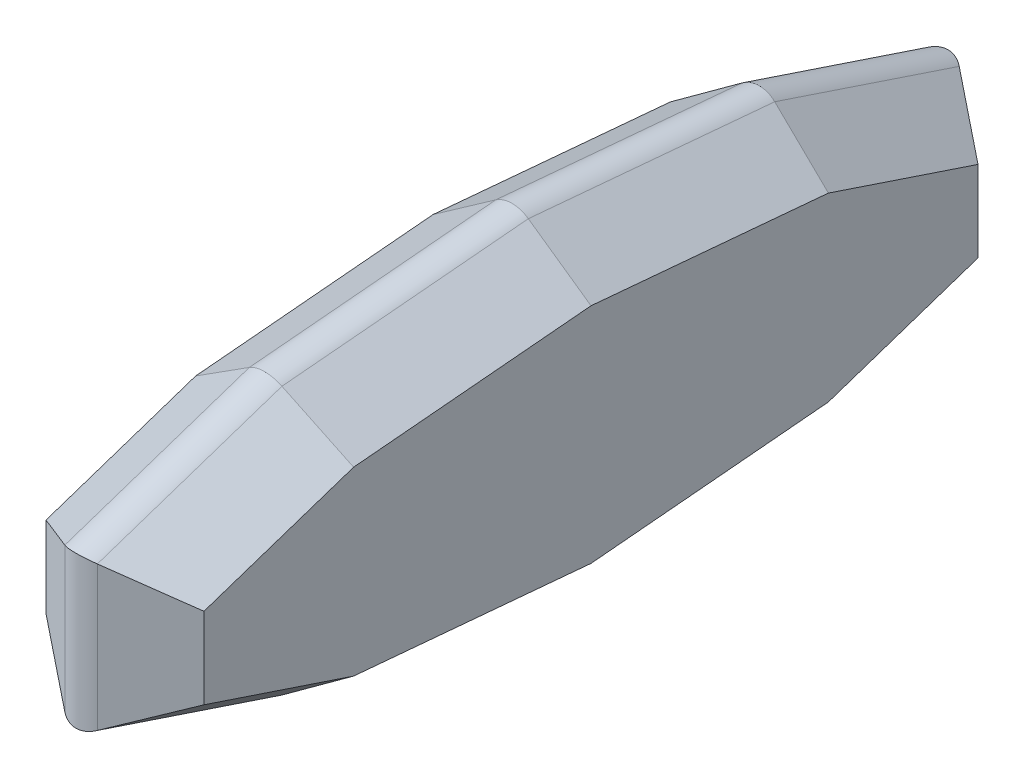
ISO-10303-21;
HEADER;
FILE_DESCRIPTION(('STEP AP214'),'2;1');
FILE_NAME('part.step','',(''),(''),'','','');
FILE_SCHEMA(('AUTOMOTIVE_DESIGN { 1 0 10303 214 1 1 1 1 }'));
ENDSEC;
DATA;
#1=APPLICATION_CONTEXT('core data for automotive mechanical design processes');
#2=APPLICATION_PROTOCOL_DEFINITION('international standard','automotive_design',2000,#1);
#3=PRODUCT_CONTEXT('',#1,'mechanical');
#4=PRODUCT('Part','Part','',(#3));
#5=PRODUCT_RELATED_PRODUCT_CATEGORY('part','',(#4));
#6=PRODUCT_DEFINITION_FORMATION('','',#4);
#7=PRODUCT_DEFINITION_CONTEXT('part definition',#1,'design');
#8=PRODUCT_DEFINITION('design','',#6,#7);
#9=PRODUCT_DEFINITION_SHAPE('','',#8);
#10=(LENGTH_UNIT() NAMED_UNIT(*) SI_UNIT(.MILLI.,.METRE.));
#11=(NAMED_UNIT(*) PLANE_ANGLE_UNIT() SI_UNIT($,.RADIAN.));
#12=(NAMED_UNIT(*) SI_UNIT($,.STERADIAN.) SOLID_ANGLE_UNIT());
#13=UNCERTAINTY_MEASURE_WITH_UNIT(LENGTH_MEASURE(1.E-05),#10,'distance_accuracy_value','');
#14=(GEOMETRIC_REPRESENTATION_CONTEXT(3) GLOBAL_UNCERTAINTY_ASSIGNED_CONTEXT((#13)) GLOBAL_UNIT_ASSIGNED_CONTEXT((#10,
#11,#12)) REPRESENTATION_CONTEXT('',''));
#15=CARTESIAN_POINT('',(0.,0.,0.));
#16=DIRECTION('',(0.,0.,1.));
#17=DIRECTION('',(1.,0.,0.));
#18=AXIS2_PLACEMENT_3D('',#15,#16,#17);
#19=CARTESIAN_POINT('',(0.,116.552688172291,-199.970092797997));
#20=DIRECTION('',(0.573576436351047,0.815932818045264,-0.0725514169368666));
#21=DIRECTION('',(-0.8180887490235,0.575091991529325,0.));
#22=AXIS2_PLACEMENT_3D('',#19,#20,#21);
#23=PLANE('',#22);
#24=DIRECTION('',(-0.817302799973305,0.564084611439917,-0.117578417630424));
#25=VECTOR('',#24,1.);
#26=CARTESIAN_POINT('',(0.,116.552688172291,-199.970092797997));
#27=LINE('',#26,#25);
#28=CARTESIAN_POINT('',(63.5,72.7263696675648,-190.834886703297));
#29=VERTEX_POINT('',#28);
#30=CARTESIAN_POINT('',(13.1119573349849,107.503100481213,-198.08378677343));
#31=VERTEX_POINT('',#30);
#32=EDGE_CURVE('E276',#29,#31,#27,.T.);
#33=ORIENTED_EDGE('',*,*,#32,.T.);
#34=DIRECTION('',(0.,-0.0885689261751643,-0.996070050406184));
#35=VECTOR('',#34,1.);
#36=CARTESIAN_POINT('',(13.1119573349849,107.407678031938,-199.156933394538));
#37=LINE('',#36,#35);
#38=CARTESIAN_POINT('',(13.111957334985,125.116388100973,0.));
#39=VERTEX_POINT('',#38);
#40=EDGE_CURVE('E353',#31,#39,#37,.F.);
#41=ORIENTED_EDGE('',*,*,#40,.T.);
#42=DIRECTION('',(-0.8180887490235,0.575091991529325,0.));
#43=VECTOR('',#42,1.);
#44=CARTESIAN_POINT('',(8.36554587553595,128.452973797929,0.));
#45=LINE('',#44,#43);
#46=CARTESIAN_POINT('',(63.5,89.6950969023388,0.));
#47=VERTEX_POINT('',#46);
#48=EDGE_CURVE('E270',#47,#39,#45,.T.);
#49=ORIENTED_EDGE('',*,*,#48,.F.);
#50=DIRECTION('',(0.,-0.0885689261751643,-0.996070050406184));
#51=VECTOR('',#50,1.);
#52=CARTESIAN_POINT('',(63.5,88.9914877793274,-7.91297811648002));
#53=LINE('',#52,#51);
#54=EDGE_CURVE('E210',#29,#47,#53,.F.);
#55=ORIENTED_EDGE('',*,*,#54,.F.);
#56=EDGE_LOOP('',(#33,#41,#49,#55));
#57=FACE_BOUND('',#56,.T.);
#58=ADVANCED_FACE('F41',(#57),#23,.T.);
#59=CARTESIAN_POINT('',(0.,116.552688172291,199.970092797997));
#60=DIRECTION('',(0.573576436351047,0.815932818045264,0.0725514169368666));
#61=DIRECTION('',(-0.8180887490235,0.575091991529325,0.));
#62=AXIS2_PLACEMENT_3D('',#59,#60,#61);
#63=PLANE('',#62);
#64=ORIENTED_EDGE('',*,*,#48,.T.);
#65=DIRECTION('',(0.,0.0885689261751643,-0.996070050406184));
#66=VECTOR('',#65,1.);
#67=CARTESIAN_POINT('',(13.1119573349849,107.407678031938,199.156933394538));
#68=LINE('',#67,#66);
#69=CARTESIAN_POINT('',(13.1119573349849,107.503100481213,198.08378677343));
#70=VERTEX_POINT('',#69);
#71=EDGE_CURVE('E348',#39,#70,#68,.F.);
#72=ORIENTED_EDGE('',*,*,#71,.T.);
#73=DIRECTION('',(-0.817302799973305,0.564084611439917,0.117578417630424));
#74=VECTOR('',#73,1.);
#75=CARTESIAN_POINT('',(9.0057692411377,110.337102170052,198.674509206515));
#76=LINE('',#75,#74);
#77=CARTESIAN_POINT('',(63.5,72.7263696675648,190.834886703297));
#78=VERTEX_POINT('',#77);
#79=EDGE_CURVE('E275',#78,#70,#76,.T.);
#80=ORIENTED_EDGE('',*,*,#79,.F.);
#81=DIRECTION('',(0.,0.0885689261751643,-0.996070050406184));
#82=VECTOR('',#81,1.);
#83=CARTESIAN_POINT('',(63.5,88.9914877793274,7.91297811648002));
#84=LINE('',#83,#82);
#85=EDGE_CURVE('E215',#47,#78,#84,.F.);
#86=ORIENTED_EDGE('',*,*,#85,.F.);
#87=EDGE_LOOP('',(#64,#72,#80,#86));
#88=FACE_BOUND('',#87,.T.);
#89=ADVANCED_FACE('F459',(#88),#63,.T.);
#90=CARTESIAN_POINT('',(0.,64.578911312509,355.6));
#91=DIRECTION('',(0.573576436351047,0.776970249544493,0.259475052722996));
#92=DIRECTION('',(-0.804525396613814,0.59391824875431,0.));
#93=AXIS2_PLACEMENT_3D('',#90,#91,#92);
#94=PLANE('',#93);
#95=ORIENTED_EDGE('',*,*,#79,.T.);
#96=DIRECTION('',(0.,0.316760550781773,-0.948505536867565));
#97=VECTOR('',#96,1.);
#98=CARTESIAN_POINT('',(13.1119573349849,55.8705953167634,352.691792441925));
#99=LINE('',#98,#97);
#100=CARTESIAN_POINT('',(13.111957334985,57.9654719969286,346.418908633359));
#101=VERTEX_POINT('',#100);
#102=EDGE_CURVE('E342',#70,#101,#99,.F.);
#103=ORIENTED_EDGE('',*,*,#102,.T.);
#104=DIRECTION('',(-0.757077956911677,0.381856727968432,0.530111692441964));
#105=VECTOR('',#104,1.);
#106=CARTESIAN_POINT('',(37.3389209571205,45.7458201461507,329.455006077208));
#107=LINE('',#106,#105);
#108=CARTESIAN_POINT('',(63.5,32.5506346936664,311.136821323683));
#109=VERTEX_POINT('',#108);
#110=EDGE_CURVE('E303',#109,#101,#107,.T.);
#111=ORIENTED_EDGE('',*,*,#110,.F.);
#112=DIRECTION('',(0.,0.316760550781773,-0.948505536867565));
#113=VECTOR('',#112,1.);
#114=CARTESIAN_POINT('',(63.5,122.765382866548,40.9984220252082));
#115=LINE('',#114,#113);
#116=EDGE_CURVE('E312',#78,#109,#115,.F.);
#117=ORIENTED_EDGE('',*,*,#116,.F.);
#118=EDGE_LOOP('',(#95,#103,#111,#117));
#119=FACE_BOUND('',#118,.T.);
#120=ADVANCED_FACE('F465',(#119),#94,.T.);
#121=CARTESIAN_POINT('',(0.,-64.578911312509,355.6));
#122=DIRECTION('',(0.573576436351047,0.,0.819152044288991));
#123=DIRECTION('',(0.819152044288991,0.,-0.573576436351047));
#124=AXIS2_PLACEMENT_3D('',#121,#122,#123);
#125=PLANE('',#124);
#126=ORIENTED_EDGE('',*,*,#110,.T.);
#127=DIRECTION('',(0.,1.,0.));
#128=VECTOR('',#127,1.);
#129=CARTESIAN_POINT('',(13.1119573349849,-64.578911312509,346.418908633359));
#130=LINE('',#129,#128);
#131=CARTESIAN_POINT('',(13.1119573349849,-57.9654719969285,346.418908633359));
#132=VERTEX_POINT('',#131);
#133=EDGE_CURVE('E274',#101,#132,#130,.F.);
#134=ORIENTED_EDGE('',*,*,#133,.T.);
#135=DIRECTION('',(-0.757077956911677,-0.381856727968432,0.530111692441964));
#136=VECTOR('',#135,1.);
#137=CARTESIAN_POINT('',(0.,-64.578911312509,355.6));
#138=LINE('',#137,#136);
#139=CARTESIAN_POINT('',(63.5,-32.5506346936664,311.136821323683));
#140=VERTEX_POINT('',#139);
#141=EDGE_CURVE('E300',#140,#132,#138,.T.);
#142=ORIENTED_EDGE('',*,*,#141,.F.);
#143=DIRECTION('',(0.,1.,0.));
#144=VECTOR('',#143,1.);
#145=CARTESIAN_POINT('',(63.5,0.,311.136821323683));
#146=LINE('',#145,#144);
#147=EDGE_CURVE('E315',#109,#140,#146,.F.);
#148=ORIENTED_EDGE('',*,*,#147,.F.);
#149=EDGE_LOOP('',(#126,#134,#142,#148));
#150=FACE_BOUND('',#149,.T.);
#151=ADVANCED_FACE('F494',(#150),#125,.T.);
#152=CARTESIAN_POINT('',(0.,-64.578911312509,355.6));
#153=DIRECTION('',(0.573576436351047,-0.776970249544493,0.259475052722996));
#154=DIRECTION('',(0.804525396613814,0.59391824875431,0.));
#155=AXIS2_PLACEMENT_3D('',#152,#153,#154);
#156=PLANE('',#155);
#157=ORIENTED_EDGE('',*,*,#141,.T.);
#158=DIRECTION('',(0.,0.316760550781773,0.948505536867565));
#159=VECTOR('',#158,1.);
#160=CARTESIAN_POINT('',(13.111957334985,-55.8705953167634,352.691792441925));
#161=LINE('',#160,#159);
#162=CARTESIAN_POINT('',(13.1119573349849,-107.503100481213,198.08378677343));
#163=VERTEX_POINT('',#162);
#164=EDGE_CURVE('E51',#132,#163,#161,.F.);
#165=ORIENTED_EDGE('',*,*,#164,.T.);
#166=DIRECTION('',(-0.817302799973305,-0.564084611439917,0.117578417630424));
#167=VECTOR('',#166,1.);
#168=CARTESIAN_POINT('',(0.,-116.552688172291,199.970092797997));
#169=LINE('',#168,#167);
#170=CARTESIAN_POINT('',(63.5,-72.7263696675648,190.834886703297));
#171=VERTEX_POINT('',#170);
#172=EDGE_CURVE('E297',#171,#163,#169,.T.);
#173=ORIENTED_EDGE('',*,*,#172,.F.);
#174=DIRECTION('',(0.,0.316760550781773,0.948505536867565));
#175=VECTOR('',#174,1.);
#176=CARTESIAN_POINT('',(63.5,-122.765382866548,40.9984220252082));
#177=LINE('',#176,#175);
#178=EDGE_CURVE('E318',#140,#171,#177,.F.);
#179=ORIENTED_EDGE('',*,*,#178,.F.);
#180=EDGE_LOOP('',(#157,#165,#173,#179));
#181=FACE_BOUND('',#180,.T.);
#182=ADVANCED_FACE('F490',(#181),#156,.T.);
#183=CARTESIAN_POINT('',(0.,-116.552688172291,199.970092797997));
#184=DIRECTION('',(0.573576436351047,-0.815932818045264,0.0725514169368666));
#185=DIRECTION('',(0.8180887490235,0.575091991529325,0.));
#186=AXIS2_PLACEMENT_3D('',#183,#184,#185);
#187=PLANE('',#186);
#188=ORIENTED_EDGE('',*,*,#172,.T.);
#189=DIRECTION('',(0.,0.0885689261751643,0.996070050406184));
#190=VECTOR('',#189,1.);
#191=CARTESIAN_POINT('',(13.1119573349849,-107.407678031938,199.156933394538));
#192=LINE('',#191,#190);
#193=CARTESIAN_POINT('',(13.111957334985,-125.116388100973,0.));
#194=VERTEX_POINT('',#193);
#195=EDGE_CURVE('E383',#163,#194,#192,.F.);
#196=ORIENTED_EDGE('',*,*,#195,.T.);
#197=DIRECTION('',(-0.8180887490235,-0.575091991529325,0.));
#198=VECTOR('',#197,1.);
#199=CARTESIAN_POINT('',(8.36554587553595,-128.452973797929,0.));
#200=LINE('',#199,#198);
#201=CARTESIAN_POINT('',(63.5,-89.6950969023388,0.));
#202=VERTEX_POINT('',#201);
#203=EDGE_CURVE('E293',#202,#194,#200,.T.);
#204=ORIENTED_EDGE('',*,*,#203,.F.);
#205=DIRECTION('',(0.,0.0885689261751643,0.996070050406184));
#206=VECTOR('',#205,1.);
#207=CARTESIAN_POINT('',(63.5,-88.9914877793274,7.91297811648002));
#208=LINE('',#207,#206);
#209=EDGE_CURVE('E321',#171,#202,#208,.F.);
#210=ORIENTED_EDGE('',*,*,#209,.F.);
#211=EDGE_LOOP('',(#188,#196,#204,#210));
#212=FACE_BOUND('',#211,.T.);
#213=ADVANCED_FACE('F486',(#212),#187,.T.);
#214=CARTESIAN_POINT('',(0.,-116.552688172291,-199.970092797997));
#215=DIRECTION('',(0.573576436351047,-0.815932818045264,-0.0725514169368666));
#216=DIRECTION('',(0.8180887490235,0.575091991529325,0.));
#217=AXIS2_PLACEMENT_3D('',#214,#215,#216);
#218=PLANE('',#217);
#219=ORIENTED_EDGE('',*,*,#203,.T.);
#220=DIRECTION('',(0.,-0.0885689261751643,0.996070050406184));
#221=VECTOR('',#220,1.);
#222=CARTESIAN_POINT('',(13.1119573349849,-107.407678031938,-199.156933394538));
#223=LINE('',#222,#221);
#224=CARTESIAN_POINT('',(13.1119573349849,-107.503100481213,-198.08378677343));
#225=VERTEX_POINT('',#224);
#226=EDGE_CURVE('E377',#194,#225,#223,.F.);
#227=ORIENTED_EDGE('',*,*,#226,.T.);
#228=DIRECTION('',(-0.817302799973305,-0.564084611439917,-0.117578417630424));
#229=VECTOR('',#228,1.);
#230=CARTESIAN_POINT('',(9.0057692411377,-110.337102170052,-198.674509206515));
#231=LINE('',#230,#229);
#232=CARTESIAN_POINT('',(63.5,-72.7263696675648,-190.834886703297));
#233=VERTEX_POINT('',#232);
#234=EDGE_CURVE('E289',#233,#225,#231,.T.);
#235=ORIENTED_EDGE('',*,*,#234,.F.);
#236=DIRECTION('',(0.,-0.0885689261751643,0.996070050406184));
#237=VECTOR('',#236,1.);
#238=CARTESIAN_POINT('',(63.5,-88.9914877793274,-7.91297811648002));
#239=LINE('',#238,#237);
#240=EDGE_CURVE('E324',#202,#233,#239,.F.);
#241=ORIENTED_EDGE('',*,*,#240,.F.);
#242=EDGE_LOOP('',(#219,#227,#235,#241));
#243=FACE_BOUND('',#242,.T.);
#244=ADVANCED_FACE('F482',(#243),#218,.T.);
#245=CARTESIAN_POINT('',(0.,-64.578911312509,-355.6));
#246=DIRECTION('',(0.573576436351047,-0.776970249544493,-0.259475052722996));
#247=DIRECTION('',(0.804525396613814,0.59391824875431,0.));
#248=AXIS2_PLACEMENT_3D('',#245,#246,#247);
#249=PLANE('',#248);
#250=ORIENTED_EDGE('',*,*,#234,.T.);
#251=DIRECTION('',(0.,-0.316760550781773,0.948505536867565));
#252=VECTOR('',#251,1.);
#253=CARTESIAN_POINT('',(13.1119573349849,-55.8705953167634,-352.691792441925));
#254=LINE('',#253,#252);
#255=CARTESIAN_POINT('',(13.1119573349849,-57.9654719969285,-346.418908633359));
#256=VERTEX_POINT('',#255);
#257=EDGE_CURVE('E371',#225,#256,#254,.F.);
#258=ORIENTED_EDGE('',*,*,#257,.T.);
#259=DIRECTION('',(-0.757077956911677,-0.381856727968432,-0.530111692441964));
#260=VECTOR('',#259,1.);
#261=CARTESIAN_POINT('',(0.,-64.578911312509,-355.6));
#262=LINE('',#261,#260);
#263=CARTESIAN_POINT('',(63.5,-32.5506346936664,-311.136821323683));
#264=VERTEX_POINT('',#263);
#265=EDGE_CURVE('E285',#264,#256,#262,.T.);
#266=ORIENTED_EDGE('',*,*,#265,.F.);
#267=DIRECTION('',(0.,-0.316760550781773,0.948505536867565));
#268=VECTOR('',#267,1.);
#269=CARTESIAN_POINT('',(63.5,-122.765382866548,-40.9984220252082));
#270=LINE('',#269,#268);
#271=EDGE_CURVE('E327',#233,#264,#270,.F.);
#272=ORIENTED_EDGE('',*,*,#271,.F.);
#273=EDGE_LOOP('',(#250,#258,#266,#272));
#274=FACE_BOUND('',#273,.T.);
#275=ADVANCED_FACE('F478',(#274),#249,.T.);
#276=CARTESIAN_POINT('',(0.,-64.578911312509,-355.6));
#277=DIRECTION('',(0.573576436351047,0.,-0.819152044288991));
#278=DIRECTION('',(-0.819152044288991,0.,-0.573576436351047));
#279=AXIS2_PLACEMENT_3D('',#276,#277,#278);
#280=PLANE('',#279);
#281=ORIENTED_EDGE('',*,*,#265,.T.);
#282=DIRECTION('',(0.,-1.,0.));
#283=VECTOR('',#282,1.);
#284=CARTESIAN_POINT('',(13.1119573349849,-64.578911312509,-346.418908633359));
#285=LINE('',#284,#283);
#286=CARTESIAN_POINT('',(13.1119573349849,57.9654719969285,-346.418908633359));
#287=VERTEX_POINT('',#286);
#288=EDGE_CURVE('E365',#256,#287,#285,.F.);
#289=ORIENTED_EDGE('',*,*,#288,.T.);
#290=DIRECTION('',(-0.757077956911677,0.381856727968432,-0.530111692441964));
#291=VECTOR('',#290,1.);
#292=CARTESIAN_POINT('',(0.,64.578911312509,-355.6));
#293=LINE('',#292,#291);
#294=CARTESIAN_POINT('',(63.5,32.5506346936664,-311.136821323683));
#295=VERTEX_POINT('',#294);
#296=EDGE_CURVE('E280',#295,#287,#293,.T.);
#297=ORIENTED_EDGE('',*,*,#296,.F.);
#298=DIRECTION('',(0.,-1.,0.));
#299=VECTOR('',#298,1.);
#300=CARTESIAN_POINT('',(63.5,0.,-311.136821323683));
#301=LINE('',#300,#299);
#302=EDGE_CURVE('E330',#264,#295,#301,.F.);
#303=ORIENTED_EDGE('',*,*,#302,.F.);
#304=EDGE_LOOP('',(#281,#289,#297,#303));
#305=FACE_BOUND('',#304,.T.);
#306=ADVANCED_FACE('F474',(#305),#280,.T.);
#307=CARTESIAN_POINT('',(0.,64.578911312509,-355.6));
#308=DIRECTION('',(0.573576436351047,0.776970249544493,-0.259475052722996));
#309=DIRECTION('',(-0.804525396613814,0.59391824875431,0.));
#310=AXIS2_PLACEMENT_3D('',#307,#308,#309);
#311=PLANE('',#310);
#312=ORIENTED_EDGE('',*,*,#296,.T.);
#313=DIRECTION('',(0.,-0.316760550781773,-0.948505536867565));
#314=VECTOR('',#313,1.);
#315=CARTESIAN_POINT('',(13.111957334985,55.8705953167634,-352.691792441925));
#316=LINE('',#315,#314);
#317=EDGE_CURVE('E359',#287,#31,#316,.F.);
#318=ORIENTED_EDGE('',*,*,#317,.T.);
#319=ORIENTED_EDGE('',*,*,#32,.F.);
#320=DIRECTION('',(0.,-0.316760550781773,-0.948505536867565));
#321=VECTOR('',#320,1.);
#322=CARTESIAN_POINT('',(63.5,122.765382866548,-40.9984220252082));
#323=LINE('',#322,#321);
#324=EDGE_CURVE('E281',#295,#29,#323,.F.);
#325=ORIENTED_EDGE('',*,*,#324,.F.);
#326=EDGE_LOOP('',(#312,#318,#319,#325));
#327=FACE_BOUND('',#326,.T.);
#328=ADVANCED_FACE('F471',(#327),#311,.T.);
#329=CARTESIAN_POINT('',(63.5,0.,0.));
#330=DIRECTION('',(-1.,0.,0.));
#331=DIRECTION('',(0.,0.,1.));
#332=AXIS2_PLACEMENT_3D('',#329,#330,#331);
#333=PLANE('',#332);
#334=ORIENTED_EDGE('',*,*,#54,.T.);
#335=ORIENTED_EDGE('',*,*,#85,.T.);
#336=ORIENTED_EDGE('',*,*,#116,.T.);
#337=ORIENTED_EDGE('',*,*,#147,.T.);
#338=ORIENTED_EDGE('',*,*,#178,.T.);
#339=ORIENTED_EDGE('',*,*,#209,.T.);
#340=ORIENTED_EDGE('',*,*,#240,.T.);
#341=ORIENTED_EDGE('',*,*,#271,.T.);
#342=ORIENTED_EDGE('',*,*,#302,.T.);
#343=ORIENTED_EDGE('',*,*,#324,.T.);
#344=EDGE_LOOP('',(#334,#335,#336,#337,#338,#339,#340,#341,#342,#343));
#345=FACE_BOUND('',#344,.T.);
#346=ADVANCED_FACE('F470',(#345),#333,.F.);
#347=CARTESIAN_POINT('',(0.,116.552688172291,199.970092797997));
#348=DIRECTION('',(-0.573576436351047,0.815932818045264,0.0725514169368666));
#349=DIRECTION('',(-0.8180887490235,-0.575091991529325,0.));
#350=AXIS2_PLACEMENT_3D('',#347,#348,#349);
#351=PLANE('',#350);
#352=DIRECTION('',(0.817302799973305,0.564084611439917,0.117578417630424));
#353=VECTOR('',#352,1.);
#354=CARTESIAN_POINT('',(0.,116.552688172291,199.970092797997));
#355=LINE('',#354,#353);
#356=CARTESIAN_POINT('',(-63.5,72.7263696675648,190.834886703297));
#357=VERTEX_POINT('',#356);
#358=CARTESIAN_POINT('',(-13.1119573349849,107.503100481213,198.08378677343));
#359=VERTEX_POINT('',#358);
#360=EDGE_CURVE('E220',#357,#359,#355,.T.);
#361=ORIENTED_EDGE('',*,*,#360,.T.);
#362=DIRECTION('',(0.,0.0885689261751643,-0.996070050406184));
#363=VECTOR('',#362,1.);
#364=CARTESIAN_POINT('',(-13.1119573349849,107.407678031938,199.156933394538));
#365=LINE('',#364,#363);
#366=CARTESIAN_POINT('',(-13.1119573349849,125.116388100973,0.));
#367=VERTEX_POINT('',#366);
#368=EDGE_CURVE('E208',#359,#367,#365,.T.);
#369=ORIENTED_EDGE('',*,*,#368,.T.);
#370=DIRECTION('',(0.8180887490235,0.575091991529325,0.));
#371=VECTOR('',#370,1.);
#372=CARTESIAN_POINT('',(0.,134.333703050757,0.));
#373=LINE('',#372,#371);
#374=CARTESIAN_POINT('',(-63.5,89.6950969023388,0.));
#375=VERTEX_POINT('',#374);
#376=EDGE_CURVE('E187',#375,#367,#373,.T.);
#377=ORIENTED_EDGE('',*,*,#376,.F.);
#378=DIRECTION('',(0.,-0.0885689261751643,0.996070050406184));
#379=VECTOR('',#378,1.);
#380=CARTESIAN_POINT('',(-63.5,72.2642475469532,196.032036808301));
#381=LINE('',#380,#379);
#382=EDGE_CURVE('E195',#357,#375,#381,.F.);
#383=ORIENTED_EDGE('',*,*,#382,.F.);
#384=EDGE_LOOP('',(#361,#369,#377,#383));
#385=FACE_BOUND('',#384,.T.);
#386=ADVANCED_FACE('F206',(#385),#351,.T.);
#387=CARTESIAN_POINT('',(0.,134.333703050757,0.));
#388=DIRECTION('',(-0.573576436351047,0.815932818045264,-0.0725514169368666));
#389=DIRECTION('',(-0.8180887490235,-0.575091991529325,0.));
#390=AXIS2_PLACEMENT_3D('',#387,#388,#389);
#391=PLANE('',#390);
#392=ORIENTED_EDGE('',*,*,#376,.T.);
#393=DIRECTION('',(0.,-0.0885689261751643,-0.996070050406184));
#394=VECTOR('',#393,1.);
#395=CARTESIAN_POINT('',(-13.1119573349849,125.188692910404,0.813159403459428));
#396=LINE('',#395,#394);
#397=CARTESIAN_POINT('',(-13.1119573349849,107.503100481213,-198.08378677343));
#398=VERTEX_POINT('',#397);
#399=EDGE_CURVE('E356',#367,#398,#396,.T.);
#400=ORIENTED_EDGE('',*,*,#399,.T.);
#401=DIRECTION('',(0.817302799973305,0.564084611439917,-0.117578417630424));
#402=VECTOR('',#401,1.);
#403=CARTESIAN_POINT('',(0.,116.552688172291,-199.970092797997));
#404=LINE('',#403,#402);
#405=CARTESIAN_POINT('',(-63.5,72.7263696675648,-190.834886703297));
#406=VERTEX_POINT('',#405);
#407=EDGE_CURVE('E190',#406,#398,#404,.T.);
#408=ORIENTED_EDGE('',*,*,#407,.F.);
#409=DIRECTION('',(0.,0.0885689261751643,0.996070050406184));
#410=VECTOR('',#409,1.);
#411=CARTESIAN_POINT('',(-63.5,90.045262425419,3.93805598969584));
#412=LINE('',#411,#410);
#413=EDGE_CURVE('E183',#375,#406,#412,.F.);
#414=ORIENTED_EDGE('',*,*,#413,.F.);
#415=EDGE_LOOP('',(#392,#400,#408,#414));
#416=FACE_BOUND('',#415,.T.);
#417=ADVANCED_FACE('F185',(#416),#391,.T.);
#418=CARTESIAN_POINT('',(0.,116.552688172291,-199.970092797997));
#419=DIRECTION('',(-0.573576436351047,0.776970249544493,-0.259475052722996));
#420=DIRECTION('',(-0.804525396613814,-0.59391824875431,0.));
#421=AXIS2_PLACEMENT_3D('',#418,#419,#420);
#422=PLANE('',#421);
#423=ORIENTED_EDGE('',*,*,#407,.T.);
#424=DIRECTION('',(0.,-0.316760550781773,-0.948505536867565));
#425=VECTOR('',#424,1.);
#426=CARTESIAN_POINT('',(-13.1119573349849,107.844372176546,-197.061885239922));
#427=LINE('',#426,#425);
#428=CARTESIAN_POINT('',(-13.1119573349849,57.9654719969285,-346.418908633359));
#429=VERTEX_POINT('',#428);
#430=EDGE_CURVE('E362',#398,#429,#427,.T.);
#431=ORIENTED_EDGE('',*,*,#430,.T.);
#432=DIRECTION('',(0.757077956911677,0.381856727968432,-0.530111692441964));
#433=VECTOR('',#432,1.);
#434=CARTESIAN_POINT('',(0.,64.578911312509,-355.6));
#435=LINE('',#434,#433);
#436=CARTESIAN_POINT('',(-63.5,32.5506346936664,-311.136821323683));
#437=VERTEX_POINT('',#436);
#438=EDGE_CURVE('E217',#437,#429,#435,.T.);
#439=ORIENTED_EDGE('',*,*,#438,.F.);
#440=DIRECTION('',(0.,0.316760550781773,0.948505536867565));
#441=VECTOR('',#440,1.);
#442=CARTESIAN_POINT('',(-63.5,74.3791170110729,-185.885911830979));
#443=LINE('',#442,#441);
#444=EDGE_CURVE('E194',#406,#437,#443,.F.);
#445=ORIENTED_EDGE('',*,*,#444,.F.);
#446=EDGE_LOOP('',(#423,#431,#439,#445));
#447=FACE_BOUND('',#446,.T.);
#448=ADVANCED_FACE('F449',(#447),#422,.T.);
#449=CARTESIAN_POINT('',(0.,64.578911312509,-355.6));
#450=DIRECTION('',(-0.573576436351047,0.,-0.819152044288991));
#451=DIRECTION('',(-0.819152044288991,0.,0.573576436351047));
#452=AXIS2_PLACEMENT_3D('',#449,#450,#451);
#453=PLANE('',#452);
#454=ORIENTED_EDGE('',*,*,#438,.T.);
#455=DIRECTION('',(0.,-1.,0.));
#456=VECTOR('',#455,1.);
#457=CARTESIAN_POINT('',(-13.1119573349849,64.578911312509,-346.418908633359));
#458=LINE('',#457,#456);
#459=CARTESIAN_POINT('',(-13.1119573349849,-57.9654719969285,-346.418908633359));
#460=VERTEX_POINT('',#459);
#461=EDGE_CURVE('E368',#429,#460,#458,.T.);
#462=ORIENTED_EDGE('',*,*,#461,.T.);
#463=DIRECTION('',(0.757077956911677,-0.381856727968432,-0.530111692441964));
#464=VECTOR('',#463,1.);
#465=CARTESIAN_POINT('',(0.,-64.578911312509,-355.6));
#466=LINE('',#465,#464);
#467=CARTESIAN_POINT('',(-63.5,-32.5506346936664,-311.136821323683));
#468=VERTEX_POINT('',#467);
#469=EDGE_CURVE('E241',#468,#460,#466,.T.);
#470=ORIENTED_EDGE('',*,*,#469,.F.);
#471=DIRECTION('',(0.,1.,0.));
#472=VECTOR('',#471,1.);
#473=CARTESIAN_POINT('',(-63.5,64.578911312509,-311.136821323683));
#474=LINE('',#473,#472);
#475=EDGE_CURVE('E250',#437,#468,#474,.F.);
#476=ORIENTED_EDGE('',*,*,#475,.F.);
#477=EDGE_LOOP('',(#454,#462,#470,#476));
#478=FACE_BOUND('',#477,.T.);
#479=ADVANCED_FACE('F439',(#478),#453,.T.);
#480=CARTESIAN_POINT('',(0.,-64.578911312509,-355.6));
#481=DIRECTION('',(-0.573576436351047,-0.776970249544493,-0.259475052722996));
#482=DIRECTION('',(0.804525396613814,-0.59391824875431,0.));
#483=AXIS2_PLACEMENT_3D('',#480,#481,#482);
#484=PLANE('',#483);
#485=ORIENTED_EDGE('',*,*,#469,.T.);
#486=DIRECTION('',(0.,-0.316760550781773,0.948505536867565));
#487=VECTOR('',#486,1.);
#488=CARTESIAN_POINT('',(-13.111957334985,-55.8705953167634,-352.691792441925));
#489=LINE('',#488,#487);
#490=CARTESIAN_POINT('',(-13.1119573349849,-107.503100481213,-198.08378677343));
#491=VERTEX_POINT('',#490);
#492=EDGE_CURVE('E374',#460,#491,#489,.T.);
#493=ORIENTED_EDGE('',*,*,#492,.T.);
#494=DIRECTION('',(0.817302799973305,-0.564084611439917,-0.117578417630424));
#495=VECTOR('',#494,1.);
#496=CARTESIAN_POINT('',(0.,-116.552688172291,-199.970092797997));
#497=LINE('',#496,#495);
#498=CARTESIAN_POINT('',(-63.5,-72.7263696675648,-190.834886703297));
#499=VERTEX_POINT('',#498);
#500=EDGE_CURVE('E237',#499,#491,#497,.T.);
#501=ORIENTED_EDGE('',*,*,#500,.F.);
#502=DIRECTION('',(0.,0.316760550781773,-0.948505536867565));
#503=VECTOR('',#502,1.);
#504=CARTESIAN_POINT('',(-63.5,-22.4053401512908,-341.515819032981));
#505=LINE('',#504,#503);
#506=EDGE_CURVE('E253',#468,#499,#505,.F.);
#507=ORIENTED_EDGE('',*,*,#506,.F.);
#508=EDGE_LOOP('',(#485,#493,#501,#507));
#509=FACE_BOUND('',#508,.T.);
#510=ADVANCED_FACE('F444',(#509),#484,.T.);
#511=CARTESIAN_POINT('',(0.,-116.552688172291,-199.970092797997));
#512=DIRECTION('',(-0.573576436351047,-0.815932818045264,-0.0725514169368666));
#513=DIRECTION('',(0.8180887490235,-0.575091991529325,0.));
#514=AXIS2_PLACEMENT_3D('',#511,#512,#513);
#515=PLANE('',#514);
#516=ORIENTED_EDGE('',*,*,#500,.T.);
#517=DIRECTION('',(0.,-0.0885689261751643,0.996070050406184));
#518=VECTOR('',#517,1.);
#519=CARTESIAN_POINT('',(-13.1119573349849,-107.407678031938,-199.156933394538));
#520=LINE('',#519,#518);
#521=CARTESIAN_POINT('',(-13.1119573349849,-125.116388100973,0.));
#522=VERTEX_POINT('',#521);
#523=EDGE_CURVE('E380',#491,#522,#520,.T.);
#524=ORIENTED_EDGE('',*,*,#523,.T.);
#525=DIRECTION('',(0.8180887490235,-0.575091991529325,0.));
#526=VECTOR('',#525,1.);
#527=CARTESIAN_POINT('',(0.,-134.333703050757,0.));
#528=LINE('',#527,#526);
#529=CARTESIAN_POINT('',(-63.5,-89.6950969023388,0.));
#530=VERTEX_POINT('',#529);
#531=EDGE_CURVE('E234',#530,#522,#528,.T.);
#532=ORIENTED_EDGE('',*,*,#531,.F.);
#533=DIRECTION('',(0.,0.0885689261751643,-0.996070050406184));
#534=VECTOR('',#533,1.);
#535=CARTESIAN_POINT('',(-63.5,-72.2642475469532,-196.032036808301));
#536=LINE('',#535,#534);
#537=EDGE_CURVE('E256',#499,#530,#536,.F.);
#538=ORIENTED_EDGE('',*,*,#537,.F.);
#539=EDGE_LOOP('',(#516,#524,#532,#538));
#540=FACE_BOUND('',#539,.T.);
#541=ADVANCED_FACE('F559',(#540),#515,.T.);
#542=CARTESIAN_POINT('',(0.,-134.333703050757,0.));
#543=DIRECTION('',(-0.573576436351047,-0.815932818045264,0.0725514169368666));
#544=DIRECTION('',(0.8180887490235,-0.575091991529325,0.));
#545=AXIS2_PLACEMENT_3D('',#542,#543,#544);
#546=PLANE('',#545);
#547=ORIENTED_EDGE('',*,*,#531,.T.);
#548=DIRECTION('',(0.,0.0885689261751643,0.996070050406184));
#549=VECTOR('',#548,1.);
#550=CARTESIAN_POINT('',(-13.1119573349849,-125.188692910404,-0.813159403459428));
#551=LINE('',#550,#549);
#552=CARTESIAN_POINT('',(-13.1119573349849,-107.503100481213,198.08378677343));
#553=VERTEX_POINT('',#552);
#554=EDGE_CURVE('E59',#522,#553,#551,.T.);
#555=ORIENTED_EDGE('',*,*,#554,.T.);
#556=DIRECTION('',(0.817302799973305,-0.564084611439917,0.117578417630424));
#557=VECTOR('',#556,1.);
#558=CARTESIAN_POINT('',(0.,-116.552688172291,199.970092797997));
#559=LINE('',#558,#557);
#560=CARTESIAN_POINT('',(-63.5,-72.7263696675648,190.834886703297));
#561=VERTEX_POINT('',#560);
#562=EDGE_CURVE('E231',#561,#553,#559,.T.);
#563=ORIENTED_EDGE('',*,*,#562,.F.);
#564=DIRECTION('',(0.,-0.0885689261751643,-0.996070050406184));
#565=VECTOR('',#564,1.);
#566=CARTESIAN_POINT('',(-63.5,-90.045262425419,-3.93805598969584));
#567=LINE('',#566,#565);
#568=EDGE_CURVE('E259',#530,#561,#567,.F.);
#569=ORIENTED_EDGE('',*,*,#568,.F.);
#570=EDGE_LOOP('',(#547,#555,#563,#569));
#571=FACE_BOUND('',#570,.T.);
#572=ADVANCED_FACE('F555',(#571),#546,.T.);
#573=CARTESIAN_POINT('',(0.,-116.552688172291,199.970092797997));
#574=DIRECTION('',(-0.573576436351047,-0.776970249544493,0.259475052722996));
#575=DIRECTION('',(0.804525396613814,-0.59391824875431,0.));
#576=AXIS2_PLACEMENT_3D('',#573,#574,#575);
#577=PLANE('',#576);
#578=ORIENTED_EDGE('',*,*,#562,.T.);
#579=DIRECTION('',(0.,0.316760550781773,0.948505536867565));
#580=VECTOR('',#579,1.);
#581=CARTESIAN_POINT('',(-13.1119573349849,-107.844372176546,197.061885239922));
#582=LINE('',#581,#580);
#583=CARTESIAN_POINT('',(-13.1119573349849,-57.9654719969285,346.418908633359));
#584=VERTEX_POINT('',#583);
#585=EDGE_CURVE('E11',#553,#584,#582,.T.);
#586=ORIENTED_EDGE('',*,*,#585,.T.);
#587=DIRECTION('',(0.757077956911677,-0.381856727968432,0.530111692441964));
#588=VECTOR('',#587,1.);
#589=CARTESIAN_POINT('',(0.,-64.578911312509,355.6));
#590=LINE('',#589,#588);
#591=CARTESIAN_POINT('',(-63.5,-32.5506346936664,311.136821323683));
#592=VERTEX_POINT('',#591);
#593=EDGE_CURVE('E227',#592,#584,#590,.T.);
#594=ORIENTED_EDGE('',*,*,#593,.F.);
#595=DIRECTION('',(0.,-0.316760550781773,-0.948505536867565));
#596=VECTOR('',#595,1.);
#597=CARTESIAN_POINT('',(-63.5,-74.3791170110729,185.885911830979));
#598=LINE('',#597,#596);
#599=EDGE_CURVE('E262',#561,#592,#598,.F.);
#600=ORIENTED_EDGE('',*,*,#599,.F.);
#601=EDGE_LOOP('',(#578,#586,#594,#600));
#602=FACE_BOUND('',#601,.T.);
#603=ADVANCED_FACE('F551',(#602),#577,.T.);
#604=CARTESIAN_POINT('',(0.,-64.578911312509,355.6));
#605=DIRECTION('',(-0.573576436351047,0.,0.819152044288991));
#606=DIRECTION('',(0.819152044288991,0.,0.573576436351047));
#607=AXIS2_PLACEMENT_3D('',#604,#605,#606);
#608=PLANE('',#607);
#609=ORIENTED_EDGE('',*,*,#593,.T.);
#610=DIRECTION('',(0.,1.,0.));
#611=VECTOR('',#610,1.);
#612=CARTESIAN_POINT('',(-13.1119573349849,-64.578911312509,346.418908633359));
#613=LINE('',#612,#611);
#614=CARTESIAN_POINT('',(-13.1119573349849,57.9654719969285,346.418908633359));
#615=VERTEX_POINT('',#614);
#616=EDGE_CURVE('E338',#584,#615,#613,.T.);
#617=ORIENTED_EDGE('',*,*,#616,.T.);
#618=DIRECTION('',(0.757077956911677,0.381856727968432,0.530111692441964));
#619=VECTOR('',#618,1.);
#620=CARTESIAN_POINT('',(0.,64.578911312509,355.6));
#621=LINE('',#620,#619);
#622=CARTESIAN_POINT('',(-63.5,32.5506346936664,311.136821323683));
#623=VERTEX_POINT('',#622);
#624=EDGE_CURVE('E223',#623,#615,#621,.T.);
#625=ORIENTED_EDGE('',*,*,#624,.F.);
#626=DIRECTION('',(0.,-1.,0.));
#627=VECTOR('',#626,1.);
#628=CARTESIAN_POINT('',(-63.5,-64.578911312509,311.136821323683));
#629=LINE('',#628,#627);
#630=EDGE_CURVE('E265',#592,#623,#629,.F.);
#631=ORIENTED_EDGE('',*,*,#630,.F.);
#632=EDGE_LOOP('',(#609,#617,#625,#631));
#633=FACE_BOUND('',#632,.T.);
#634=ADVANCED_FACE('F543',(#633),#608,.T.);
#635=CARTESIAN_POINT('',(0.,64.578911312509,355.6));
#636=DIRECTION('',(-0.573576436351047,0.776970249544493,0.259475052722996));
#637=DIRECTION('',(-0.804525396613814,-0.59391824875431,0.));
#638=AXIS2_PLACEMENT_3D('',#635,#636,#637);
#639=PLANE('',#638);
#640=ORIENTED_EDGE('',*,*,#624,.T.);
#641=DIRECTION('',(0.,0.316760550781773,-0.948505536867565));
#642=VECTOR('',#641,1.);
#643=CARTESIAN_POINT('',(-13.111957334985,55.8705953167634,352.691792441925));
#644=LINE('',#643,#642);
#645=EDGE_CURVE('E345',#615,#359,#644,.T.);
#646=ORIENTED_EDGE('',*,*,#645,.T.);
#647=ORIENTED_EDGE('',*,*,#360,.F.);
#648=DIRECTION('',(0.,-0.316760550781773,0.948505536867565));
#649=VECTOR('',#648,1.);
#650=CARTESIAN_POINT('',(-63.5,22.4053401512908,341.515819032981));
#651=LINE('',#650,#649);
#652=EDGE_CURVE('E200',#623,#357,#651,.F.);
#653=ORIENTED_EDGE('',*,*,#652,.F.);
#654=EDGE_LOOP('',(#640,#646,#647,#653));
#655=FACE_BOUND('',#654,.T.);
#656=ADVANCED_FACE('F538',(#655),#639,.T.);
#657=CARTESIAN_POINT('',(-63.5,0.,0.));
#658=DIRECTION('',(-1.,0.,0.));
#659=DIRECTION('',(0.,0.,1.));
#660=AXIS2_PLACEMENT_3D('',#657,#658,#659);
#661=PLANE('',#660);
#662=ORIENTED_EDGE('',*,*,#382,.T.);
#663=ORIENTED_EDGE('',*,*,#413,.T.);
#664=ORIENTED_EDGE('',*,*,#444,.T.);
#665=ORIENTED_EDGE('',*,*,#475,.T.);
#666=ORIENTED_EDGE('',*,*,#506,.T.);
#667=ORIENTED_EDGE('',*,*,#537,.T.);
#668=ORIENTED_EDGE('',*,*,#568,.T.);
#669=ORIENTED_EDGE('',*,*,#599,.T.);
#670=ORIENTED_EDGE('',*,*,#630,.T.);
#671=ORIENTED_EDGE('',*,*,#652,.T.);
#672=EDGE_LOOP('',(#662,#663,#664,#665,#666,#667,#668,#669,#670,#671));
#673=FACE_BOUND('',#672,.T.);
#674=ADVANCED_FACE('F198',(#673),#661,.T.);
#675=CARTESIAN_POINT('',(0.,-64.578911312509,-327.693092900913));
#676=DIRECTION('',(0.,1.,0.));
#677=DIRECTION('',(0.,0.,1.));
#678=AXIS2_PLACEMENT_3D('',#675,#676,#677);
#679=CYLINDRICAL_SURFACE('',#678,22.86);
#680=CARTESIAN_POINT('',(0.,-44.4766566659696,-327.693092900913));
#681=DIRECTION('',(0.,0.81140635651373,-0.584482441660238));
#682=DIRECTION('',(0.,-0.584482441660238,-0.81140635651373));
#683=AXIS2_PLACEMENT_3D('',#680,#681,#682);
#684=ELLIPSE('',#683,28.1733065269784,22.86);
#685=EDGE_CURVE('E419',#460,#256,#684,.F.);
#686=ORIENTED_EDGE('',*,*,#685,.F.);
#687=ORIENTED_EDGE('',*,*,#461,.F.);
#688=CARTESIAN_POINT('',(0.,44.4766566659696,-327.693092900913));
#689=DIRECTION('',(0.,0.81140635651373,0.584482441660238));
#690=DIRECTION('',(0.,0.584482441660238,-0.81140635651373));
#691=AXIS2_PLACEMENT_3D('',#688,#689,#690);
#692=ELLIPSE('',#691,28.1733065269784,22.86);
#693=EDGE_CURVE('E45',#287,#429,#692,.T.);
#694=ORIENTED_EDGE('',*,*,#693,.F.);
#695=ORIENTED_EDGE('',*,*,#288,.F.);
#696=EDGE_LOOP('',(#686,#687,#694,#695));
#697=FACE_BOUND('',#696,.T.);
#698=ADVANCED_FACE('F43',(#697),#679,.T.);
#699=CARTESIAN_POINT('',(0.,38.1090554121763,-346.760192736677));
#700=DIRECTION('',(0.,0.316760550781773,0.948505536867565));
#701=DIRECTION('',(0.,-0.948505536867565,0.316760550781773));
#702=AXIS2_PLACEMENT_3D('',#699,#700,#701);
#703=CYLINDRICAL_SURFACE('',#702,22.86);
#704=ORIENTED_EDGE('',*,*,#693,.T.);
#705=ORIENTED_EDGE('',*,*,#430,.F.);
#706=CARTESIAN_POINT('',(0.,89.0455005303546,-194.236464312466));
#707=DIRECTION('',(0.,0.204055364937038,0.978959349534194));
#708=DIRECTION('',(0.,0.978959349534194,-0.204055364937037));
#709=AXIS2_PLACEMENT_3D('',#706,#707,#708);
#710=ELLIPSE('',#709,23.0168586675785,22.86);
#711=EDGE_CURVE('E416',#31,#398,#710,.T.);
#712=ORIENTED_EDGE('',*,*,#711,.F.);
#713=ORIENTED_EDGE('',*,*,#317,.F.);
#714=EDGE_LOOP('',(#704,#705,#712,#713));
#715=FACE_BOUND('',#714,.T.);
#716=ADVANCED_FACE('F432',(#715),#703,.T.);
#717=CARTESIAN_POINT('',(0.,-38.1090554121763,-346.760192736677));
#718=DIRECTION('',(0.,0.316760550781773,-0.948505536867565));
#719=DIRECTION('',(0.,0.948505536867565,0.316760550781773));
#720=AXIS2_PLACEMENT_3D('',#717,#718,#719);
#721=CYLINDRICAL_SURFACE('',#720,22.86);
#722=ORIENTED_EDGE('',*,*,#685,.T.);
#723=ORIENTED_EDGE('',*,*,#257,.F.);
#724=CARTESIAN_POINT('',(0.,-89.0455005303547,-194.236464312465));
#725=DIRECTION('',(0.,0.204055364937038,-0.978959349534194));
#726=DIRECTION('',(0.,-0.978959349534194,-0.204055364937037));
#727=AXIS2_PLACEMENT_3D('',#724,#725,#726);
#728=ELLIPSE('',#727,23.0168586675785,22.86);
#729=EDGE_CURVE('E412',#491,#225,#728,.F.);
#730=ORIENTED_EDGE('',*,*,#729,.F.);
#731=ORIENTED_EDGE('',*,*,#492,.F.);
#732=EDGE_LOOP('',(#722,#723,#730,#731));
#733=FACE_BOUND('',#732,.T.);
#734=ADVANCED_FACE('F528',(#733),#721,.T.);
#735=CARTESIAN_POINT('',(0.,88.7554538114229,-197.498408003361));
#736=DIRECTION('',(0.,0.0885689261751643,0.996070050406184));
#737=DIRECTION('',(0.,-0.996070050406184,0.0885689261751643));
#738=AXIS2_PLACEMENT_3D('',#735,#736,#737);
#739=CYLINDRICAL_SURFACE('',#738,22.86);
#740=ORIENTED_EDGE('',*,*,#711,.T.);
#741=ORIENTED_EDGE('',*,*,#399,.F.);
#742=CARTESIAN_POINT('',(0.,106.316690504594,2.77555756156289E-13));
#743=DIRECTION('',(0.,0.,1.));
#744=DIRECTION('',(0.,1.,0.));
#745=AXIS2_PLACEMENT_3D('',#742,#743,#744);
#746=ELLIPSE('',#745,22.9501931020594,22.86);
#747=EDGE_CURVE('E408',#39,#367,#746,.T.);
#748=ORIENTED_EDGE('',*,*,#747,.F.);
#749=ORIENTED_EDGE('',*,*,#40,.F.);
#750=EDGE_LOOP('',(#740,#741,#748,#749));
#751=FACE_BOUND('',#750,.T.);
#752=ADVANCED_FACE('F524',(#751),#739,.T.);
#753=CARTESIAN_POINT('',(0.,-88.7554538114229,-197.498408003361));
#754=DIRECTION('',(0.,0.0885689261751643,-0.996070050406184));
#755=DIRECTION('',(0.,0.996070050406184,0.0885689261751643));
#756=AXIS2_PLACEMENT_3D('',#753,#754,#755);
#757=CYLINDRICAL_SURFACE('',#756,22.86);
#758=ORIENTED_EDGE('',*,*,#729,.T.);
#759=ORIENTED_EDGE('',*,*,#226,.F.);
#760=CARTESIAN_POINT('',(0.,-106.316690504594,-2.77555756156289E-13));
#761=DIRECTION('',(0.,0.,-1.));
#762=DIRECTION('',(0.,-1.,0.));
#763=AXIS2_PLACEMENT_3D('',#760,#761,#762);
#764=ELLIPSE('',#763,22.9501931020594,22.86);
#765=EDGE_CURVE('E404',#522,#194,#764,.F.);
#766=ORIENTED_EDGE('',*,*,#765,.F.);
#767=ORIENTED_EDGE('',*,*,#523,.F.);
#768=EDGE_LOOP('',(#758,#759,#766,#767));
#769=FACE_BOUND('',#768,.T.);
#770=ADVANCED_FACE('F520',(#769),#757,.T.);
#771=CARTESIAN_POINT('',(0.,88.7554538114229,197.498408003361));
#772=DIRECTION('',(0.,-0.0885689261751643,0.996070050406184));
#773=DIRECTION('',(0.,-0.996070050406184,-0.0885689261751643));
#774=AXIS2_PLACEMENT_3D('',#771,#772,#773);
#775=CYLINDRICAL_SURFACE('',#774,22.86);
#776=ORIENTED_EDGE('',*,*,#747,.T.);
#777=ORIENTED_EDGE('',*,*,#368,.F.);
#778=CARTESIAN_POINT('',(0.,89.0455005303547,194.236464312465));
#779=DIRECTION('',(0.,-0.204055364937038,0.978959349534194));
#780=DIRECTION('',(0.,0.978959349534194,0.204055364937037));
#781=AXIS2_PLACEMENT_3D('',#778,#779,#780);
#782=ELLIPSE('',#781,23.0168586675785,22.86);
#783=EDGE_CURVE('E400',#70,#359,#782,.T.);
#784=ORIENTED_EDGE('',*,*,#783,.F.);
#785=ORIENTED_EDGE('',*,*,#71,.F.);
#786=EDGE_LOOP('',(#776,#777,#784,#785));
#787=FACE_BOUND('',#786,.T.);
#788=ADVANCED_FACE('F516',(#787),#775,.T.);
#789=CARTESIAN_POINT('',(0.,-88.7554538114229,197.498408003361));
#790=DIRECTION('',(0.,-0.0885689261751643,-0.996070050406184));
#791=DIRECTION('',(0.,0.996070050406184,-0.0885689261751643));
#792=AXIS2_PLACEMENT_3D('',#789,#790,#791);
#793=CYLINDRICAL_SURFACE('',#792,22.86);
#794=ORIENTED_EDGE('',*,*,#765,.T.);
#795=ORIENTED_EDGE('',*,*,#195,.F.);
#796=CARTESIAN_POINT('',(0.,-89.0455005303546,194.236464312466));
#797=DIRECTION('',(0.,-0.204055364937038,-0.978959349534194));
#798=DIRECTION('',(0.,-0.978959349534194,0.204055364937037));
#799=AXIS2_PLACEMENT_3D('',#796,#797,#798);
#800=ELLIPSE('',#799,23.0168586675785,22.86);
#801=EDGE_CURVE('E396',#553,#163,#800,.F.);
#802=ORIENTED_EDGE('',*,*,#801,.F.);
#803=ORIENTED_EDGE('',*,*,#554,.F.);
#804=EDGE_LOOP('',(#794,#795,#802,#803));
#805=FACE_BOUND('',#804,.T.);
#806=ADVANCED_FACE('F512',(#805),#793,.T.);
#807=CARTESIAN_POINT('',(0.,38.1090554121763,346.760192736677));
#808=DIRECTION('',(0.,-0.316760550781773,0.948505536867565));
#809=DIRECTION('',(0.,-0.948505536867565,-0.316760550781773));
#810=AXIS2_PLACEMENT_3D('',#807,#808,#809);
#811=CYLINDRICAL_SURFACE('',#810,22.86);
#812=ORIENTED_EDGE('',*,*,#783,.T.);
#813=ORIENTED_EDGE('',*,*,#645,.F.);
#814=CARTESIAN_POINT('',(0.,44.4766566659696,327.693092900913));
#815=DIRECTION('',(0.,-0.81140635651373,0.584482441660238));
#816=DIRECTION('',(0.,0.584482441660238,0.81140635651373));
#817=AXIS2_PLACEMENT_3D('',#814,#815,#816);
#818=ELLIPSE('',#817,28.1733065269784,22.86);
#819=EDGE_CURVE('E393',#101,#615,#818,.T.);
#820=ORIENTED_EDGE('',*,*,#819,.F.);
#821=ORIENTED_EDGE('',*,*,#102,.F.);
#822=EDGE_LOOP('',(#812,#813,#820,#821));
#823=FACE_BOUND('',#822,.T.);
#824=ADVANCED_FACE('F508',(#823),#811,.T.);
#825=CARTESIAN_POINT('',(0.,-38.1090554121763,346.760192736677));
#826=DIRECTION('',(0.,-0.316760550781773,-0.948505536867565));
#827=DIRECTION('',(0.,0.948505536867565,-0.316760550781773));
#828=AXIS2_PLACEMENT_3D('',#825,#826,#827);
#829=CYLINDRICAL_SURFACE('',#828,22.86);
#830=ORIENTED_EDGE('',*,*,#801,.T.);
#831=ORIENTED_EDGE('',*,*,#164,.F.);
#832=CARTESIAN_POINT('',(0.,-44.4766566659696,327.693092900913));
#833=DIRECTION('',(0.,-0.81140635651373,-0.584482441660238));
#834=DIRECTION('',(0.,0.584482441660238,-0.81140635651373));
#835=AXIS2_PLACEMENT_3D('',#832,#833,#834);
#836=ELLIPSE('',#835,28.1733065269784,22.86);
#837=EDGE_CURVE('E390',#584,#132,#836,.F.);
#838=ORIENTED_EDGE('',*,*,#837,.F.);
#839=ORIENTED_EDGE('',*,*,#585,.F.);
#840=EDGE_LOOP('',(#830,#831,#838,#839));
#841=FACE_BOUND('',#840,.T.);
#842=ADVANCED_FACE('F504',(#841),#829,.T.);
#843=CARTESIAN_POINT('',(0.,-64.578911312509,327.693092900913));
#844=DIRECTION('',(0.,-1.,0.));
#845=DIRECTION('',(0.,0.,-1.));
#846=AXIS2_PLACEMENT_3D('',#843,#844,#845);
#847=CYLINDRICAL_SURFACE('',#846,22.86);
#848=ORIENTED_EDGE('',*,*,#819,.T.);
#849=ORIENTED_EDGE('',*,*,#616,.F.);
#850=ORIENTED_EDGE('',*,*,#837,.T.);
#851=ORIENTED_EDGE('',*,*,#133,.F.);
#852=EDGE_LOOP('',(#848,#849,#850,#851));
#853=FACE_BOUND('',#852,.T.);
#854=ADVANCED_FACE('F501',(#853),#847,.T.);
#855=CLOSED_SHELL('',(#58,#89,#120,#151,#182,#213,#244,#275,#306,#328,#346,#386,#417,#448,#479,
#510,#541,#572,#603,#634,#656,#674,#698,#716,#734,#752,#770,#788,#806,#824,#842,#854));
#856=MANIFOLD_SOLID_BREP('B2',#855);
#857=ADVANCED_BREP_SHAPE_REPRESENTATION('',(#18,#856),#14);
#858=SHAPE_DEFINITION_REPRESENTATION(#9,#857);
ENDSEC;
END-ISO-10303-21;
